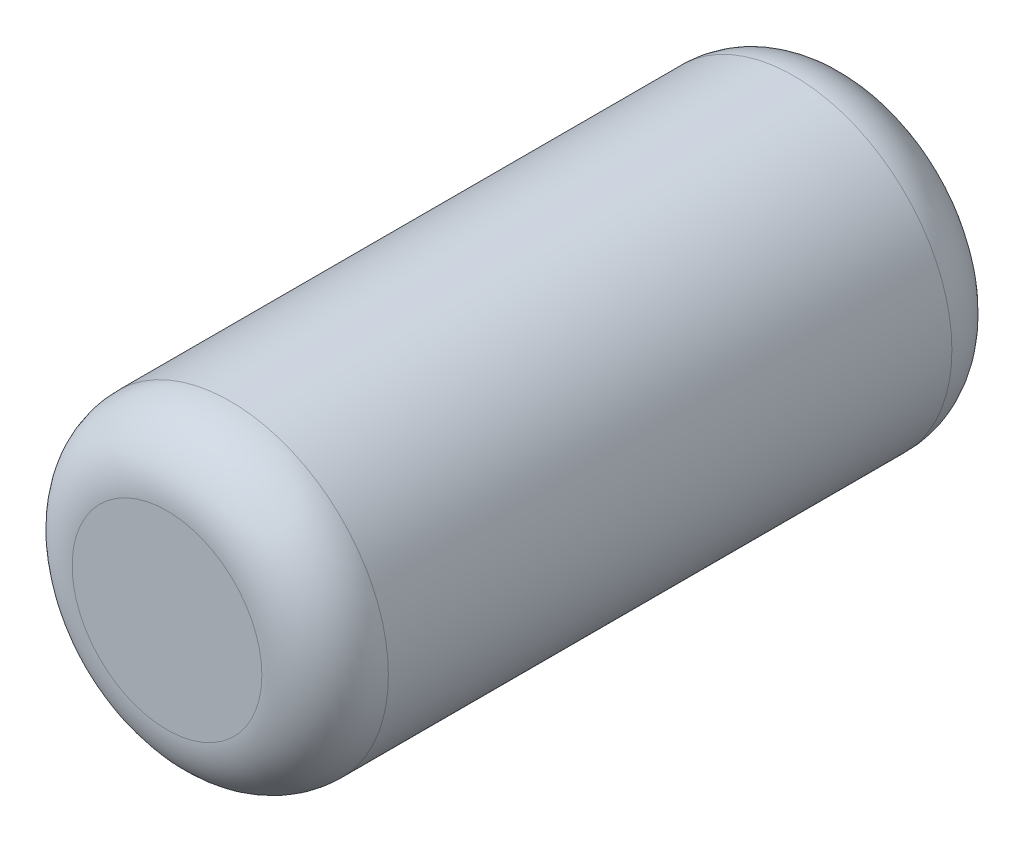
ISO-10303-21;
HEADER;
FILE_DESCRIPTION(('STEP AP214'),'2;1');
FILE_NAME('part.step','',(''),(''),'','','');
FILE_SCHEMA(('AUTOMOTIVE_DESIGN { 1 0 10303 214 1 1 1 1 }'));
ENDSEC;
DATA;
#1=APPLICATION_CONTEXT('core data for automotive mechanical design processes');
#2=APPLICATION_PROTOCOL_DEFINITION('international standard','automotive_design',2000,#1);
#3=PRODUCT_CONTEXT('',#1,'mechanical');
#4=PRODUCT('Part','Part','',(#3));
#5=PRODUCT_RELATED_PRODUCT_CATEGORY('part','',(#4));
#6=PRODUCT_DEFINITION_FORMATION('','',#4);
#7=PRODUCT_DEFINITION_CONTEXT('part definition',#1,'design');
#8=PRODUCT_DEFINITION('design','',#6,#7);
#9=PRODUCT_DEFINITION_SHAPE('','',#8);
#10=(LENGTH_UNIT() NAMED_UNIT(*) SI_UNIT(.MILLI.,.METRE.));
#11=(NAMED_UNIT(*) PLANE_ANGLE_UNIT() SI_UNIT($,.RADIAN.));
#12=(NAMED_UNIT(*) SI_UNIT($,.STERADIAN.) SOLID_ANGLE_UNIT());
#13=UNCERTAINTY_MEASURE_WITH_UNIT(LENGTH_MEASURE(1.E-05),#10,'distance_accuracy_value','');
#14=(GEOMETRIC_REPRESENTATION_CONTEXT(3) GLOBAL_UNCERTAINTY_ASSIGNED_CONTEXT((#13)) GLOBAL_UNIT_ASSIGNED_CONTEXT((#10,
#11,#12)) REPRESENTATION_CONTEXT('',''));
#15=CARTESIAN_POINT('',(0.,0.,0.));
#16=DIRECTION('',(0.,0.,1.));
#17=DIRECTION('',(1.,0.,0.));
#18=AXIS2_PLACEMENT_3D('',#15,#16,#17);
#19=CARTESIAN_POINT('',(0.,0.,152.4));
#20=DIRECTION('',(0.,0.,-1.));
#21=DIRECTION('',(-1.,0.,0.));
#22=AXIS2_PLACEMENT_3D('',#19,#20,#21);
#23=CYLINDRICAL_SURFACE('',#22,34.925);
#24=CARTESIAN_POINT('',(0.,0.,138.43));
#25=DIRECTION('',(0.,0.,1.));
#26=DIRECTION('',(1.,0.,0.));
#27=AXIS2_PLACEMENT_3D('',#24,#25,#26);
#28=CIRCLE('',#27,34.925);
#29=CARTESIAN_POINT('',(-34.925,0.,138.43));
#30=VERTEX_POINT('',#29);
#31=EDGE_CURVE('E38',#30,#30,#28,.F.);
#32=CARTESIAN_POINT('',(0.,0.,13.97));
#33=DIRECTION('',(0.,0.,1.));
#34=DIRECTION('',(1.,0.,0.));
#35=AXIS2_PLACEMENT_3D('',#32,#33,#34);
#36=CIRCLE('',#35,34.925);
#37=CARTESIAN_POINT('',(-34.925,0.,13.97));
#38=VERTEX_POINT('',#37);
#39=EDGE_CURVE('E42',#38,#38,#36,.T.);
#40=CARTESIAN_POINT('',(-34.925,0.,138.43));
#41=CARTESIAN_POINT('',(-34.925,0.,137.133541666667));
#42=CARTESIAN_POINT('',(-34.925,0.,135.837083333333));
#43=CARTESIAN_POINT('',(-34.925,0.,133.244166666667));
#44=CARTESIAN_POINT('',(-34.925,0.,131.947708333333));
#45=CARTESIAN_POINT('',(-34.925,0.,129.354791666667));
#46=CARTESIAN_POINT('',(-34.925,0.,128.058333333333));
#47=CARTESIAN_POINT('',(-34.925,0.,125.465416666667));
#48=CARTESIAN_POINT('',(-34.925,0.,124.168958333333));
#49=CARTESIAN_POINT('',(-34.925,0.,121.576041666667));
#50=CARTESIAN_POINT('',(-34.925,0.,120.279583333333));
#51=CARTESIAN_POINT('',(-34.925,0.,117.686666666667));
#52=CARTESIAN_POINT('',(-34.925,0.,116.390208333333));
#53=CARTESIAN_POINT('',(-34.925,0.,113.797291666667));
#54=CARTESIAN_POINT('',(-34.925,0.,112.500833333333));
#55=CARTESIAN_POINT('',(-34.925,0.,109.907916666667));
#56=CARTESIAN_POINT('',(-34.925,0.,108.611458333333));
#57=CARTESIAN_POINT('',(-34.925,0.,106.018541666667));
#58=CARTESIAN_POINT('',(-34.925,0.,104.722083333333));
#59=CARTESIAN_POINT('',(-34.925,0.,102.129166666667));
#60=CARTESIAN_POINT('',(-34.925,0.,100.832708333333));
#61=CARTESIAN_POINT('',(-34.925,0.,98.2397916666666));
#62=CARTESIAN_POINT('',(-34.925,0.,96.9433333333333));
#63=CARTESIAN_POINT('',(-34.925,0.,94.3504166666666));
#64=CARTESIAN_POINT('',(-34.925,0.,93.0539583333333));
#65=CARTESIAN_POINT('',(-34.925,0.,90.4610416666666));
#66=CARTESIAN_POINT('',(-34.925,0.,89.1645833333333));
#67=CARTESIAN_POINT('',(-34.925,0.,86.5716666666666));
#68=CARTESIAN_POINT('',(-34.925,0.,85.2752083333333));
#69=CARTESIAN_POINT('',(-34.925,0.,82.6822916666666));
#70=CARTESIAN_POINT('',(-34.925,0.,81.3858333333333));
#71=CARTESIAN_POINT('',(-34.925,0.,78.7929166666666));
#72=CARTESIAN_POINT('',(-34.925,0.,77.4964583333333));
#73=CARTESIAN_POINT('',(-34.925,0.,74.9035416666666));
#74=CARTESIAN_POINT('',(-34.925,0.,73.6070833333333));
#75=CARTESIAN_POINT('',(-34.925,0.,71.0141666666666));
#76=CARTESIAN_POINT('',(-34.925,0.,69.7177083333333));
#77=CARTESIAN_POINT('',(-34.925,0.,67.1247916666666));
#78=CARTESIAN_POINT('',(-34.925,0.,65.8283333333333));
#79=CARTESIAN_POINT('',(-34.925,0.,63.2354166666666));
#80=CARTESIAN_POINT('',(-34.925,0.,61.9389583333333));
#81=CARTESIAN_POINT('',(-34.925,0.,59.3460416666666));
#82=CARTESIAN_POINT('',(-34.925,0.,58.0495833333333));
#83=CARTESIAN_POINT('',(-34.925,0.,55.4566666666666));
#84=CARTESIAN_POINT('',(-34.925,0.,54.1602083333333));
#85=CARTESIAN_POINT('',(-34.925,0.,51.5672916666666));
#86=CARTESIAN_POINT('',(-34.925,0.,50.2708333333333));
#87=CARTESIAN_POINT('',(-34.925,0.,47.6779166666666));
#88=CARTESIAN_POINT('',(-34.925,0.,46.3814583333333));
#89=CARTESIAN_POINT('',(-34.925,0.,43.7885416666666));
#90=CARTESIAN_POINT('',(-34.925,0.,42.4920833333333));
#91=CARTESIAN_POINT('',(-34.925,0.,39.8991666666666));
#92=CARTESIAN_POINT('',(-34.925,0.,38.6027083333333));
#93=CARTESIAN_POINT('',(-34.925,0.,36.0097916666666));
#94=CARTESIAN_POINT('',(-34.925,0.,34.7133333333333));
#95=CARTESIAN_POINT('',(-34.925,0.,32.1204166666666));
#96=CARTESIAN_POINT('',(-34.925,0.,30.8239583333333));
#97=CARTESIAN_POINT('',(-34.925,0.,28.2310416666666));
#98=CARTESIAN_POINT('',(-34.925,0.,26.9345833333333));
#99=CARTESIAN_POINT('',(-34.925,0.,24.3416666666667));
#100=CARTESIAN_POINT('',(-34.925,0.,23.0452083333333));
#101=CARTESIAN_POINT('',(-34.925,0.,20.4522916666666));
#102=CARTESIAN_POINT('',(-34.925,0.,19.1558333333333));
#103=CARTESIAN_POINT('',(-34.925,0.,16.5629166666666));
#104=CARTESIAN_POINT('',(-34.925,0.,15.2664583333333));
#105=CARTESIAN_POINT('',(-34.925,0.,13.97));
#106=B_SPLINE_CURVE_WITH_KNOTS('',3,(#40,#41,#42,#43,#44,#45,#46,#47,#48,#49,#50,#51,#52,#53,
#54,#55,#56,#57,#58,#59,#60,#61,#62,#63,#64,#65,#66,#67,#68,#69,#70,#71,#72,#73,#74,#75,#76,#77,
#78,#79,#80,#81,#82,#83,#84,#85,#86,#87,#88,#89,#90,#91,#92,#93,#94,#95,#96,#97,#98,#99,#100,
#101,#102,#103,#104,#105),.UNSPECIFIED.,.F.,.F.,(4,2,2,2,2,2,2,2,2,2,2,2,2,2,2,2,2,2,2,2,2,2,2,
2,2,2,2,2,2,2,2,2,4),(0.,3.889375,7.77874999999997,11.668125,15.5575,19.446875,23.33625,
27.225625,31.115,35.004375,38.89375,42.783125,46.6725,50.561875,54.45125,58.340625,62.23,
66.119375,70.00875,73.898125,77.7875,81.676875,85.56625,89.455625,93.345,97.234375,101.12375,
105.013125,108.9025,112.791875,116.68125,120.570625,124.46),.UNSPECIFIED.);
#107=EDGE_CURVE('BSEAM31',#30,#38,#106,.T.);
#108=ORIENTED_EDGE('',*,*,#31,.T.);
#109=ORIENTED_EDGE('',*,*,#39,.T.);
#110=ORIENTED_EDGE('',*,*,#107,.T.);
#111=ORIENTED_EDGE('',*,*,#107,.F.);
#112=EDGE_LOOP('',(#108,#110,#109,#111));
#113=FACE_BOUND('',#112,.T.);
#114=ADVANCED_FACE('F31',(#113),#23,.T.);
#115=CARTESIAN_POINT('',(0.,0.,152.4));
#116=DIRECTION('',(0.,0.,1.));
#117=DIRECTION('',(1.,0.,0.));
#118=AXIS2_PLACEMENT_3D('',#115,#116,#117);
#119=PLANE('',#118);
#120=CARTESIAN_POINT('',(0.,0.,152.4));
#121=DIRECTION('',(0.,0.,1.));
#122=DIRECTION('',(1.,0.,0.));
#123=AXIS2_PLACEMENT_3D('',#120,#121,#122);
#124=CIRCLE('',#123,20.955);
#125=CARTESIAN_POINT('',(20.955,0.,152.4));
#126=VERTEX_POINT('',#125);
#127=EDGE_CURVE('E46',#126,#126,#124,.T.);
#128=ORIENTED_EDGE('',*,*,#127,.T.);
#129=EDGE_LOOP('',(#128));
#130=FACE_BOUND('',#129,.T.);
#131=ADVANCED_FACE('F52',(#130),#119,.T.);
#132=CARTESIAN_POINT('',(0.,0.,0.));
#133=DIRECTION('',(0.,0.,1.));
#134=DIRECTION('',(1.,0.,0.));
#135=AXIS2_PLACEMENT_3D('',#132,#133,#134);
#136=PLANE('',#135);
#137=CARTESIAN_POINT('',(0.,0.,0.));
#138=DIRECTION('',(0.,0.,1.));
#139=DIRECTION('',(1.,0.,0.));
#140=AXIS2_PLACEMENT_3D('',#137,#138,#139);
#141=CIRCLE('',#140,20.955);
#142=CARTESIAN_POINT('',(20.955,0.,0.));
#143=VERTEX_POINT('',#142);
#144=EDGE_CURVE('E10',#143,#143,#141,.F.);
#145=ORIENTED_EDGE('',*,*,#144,.T.);
#146=EDGE_LOOP('',(#145));
#147=FACE_BOUND('',#146,.T.);
#148=ADVANCED_FACE('F56',(#147),#136,.F.);
#149=CARTESIAN_POINT('',(0.,0.,138.43));
#150=DIRECTION('',(0.,0.,1.));
#151=DIRECTION('',(1.,0.,0.));
#152=AXIS2_PLACEMENT_3D('',#149,#150,#151);
#153=TOROIDAL_SURFACE('',#152,20.955,13.97);
#154=ORIENTED_EDGE('',*,*,#31,.F.);
#155=EDGE_LOOP('',(#154));
#156=FACE_BOUND('',#155,.T.);
#157=ORIENTED_EDGE('',*,*,#127,.F.);
#158=EDGE_LOOP('',(#157));
#159=FACE_BOUND('',#158,.T.);
#160=ADVANCED_FACE('F54',(#156,#159),#153,.T.);
#161=CARTESIAN_POINT('',(0.,0.,13.97));
#162=DIRECTION('',(0.,0.,1.));
#163=DIRECTION('',(1.,0.,0.));
#164=AXIS2_PLACEMENT_3D('',#161,#162,#163);
#165=TOROIDAL_SURFACE('',#164,20.955,13.97);
#166=ORIENTED_EDGE('',*,*,#144,.F.);
#167=EDGE_LOOP('',(#166));
#168=FACE_BOUND('',#167,.T.);
#169=ORIENTED_EDGE('',*,*,#39,.F.);
#170=EDGE_LOOP('',(#169));
#171=FACE_BOUND('',#170,.T.);
#172=ADVANCED_FACE('F33',(#168,#171),#165,.T.);
#173=CLOSED_SHELL('',(#114,#131,#148,#160,#172));
#174=MANIFOLD_SOLID_BREP('B2',#173);
#175=ADVANCED_BREP_SHAPE_REPRESENTATION('',(#18,#174),#14);
#176=SHAPE_DEFINITION_REPRESENTATION(#9,#175);
ENDSEC;
END-ISO-10303-21;
